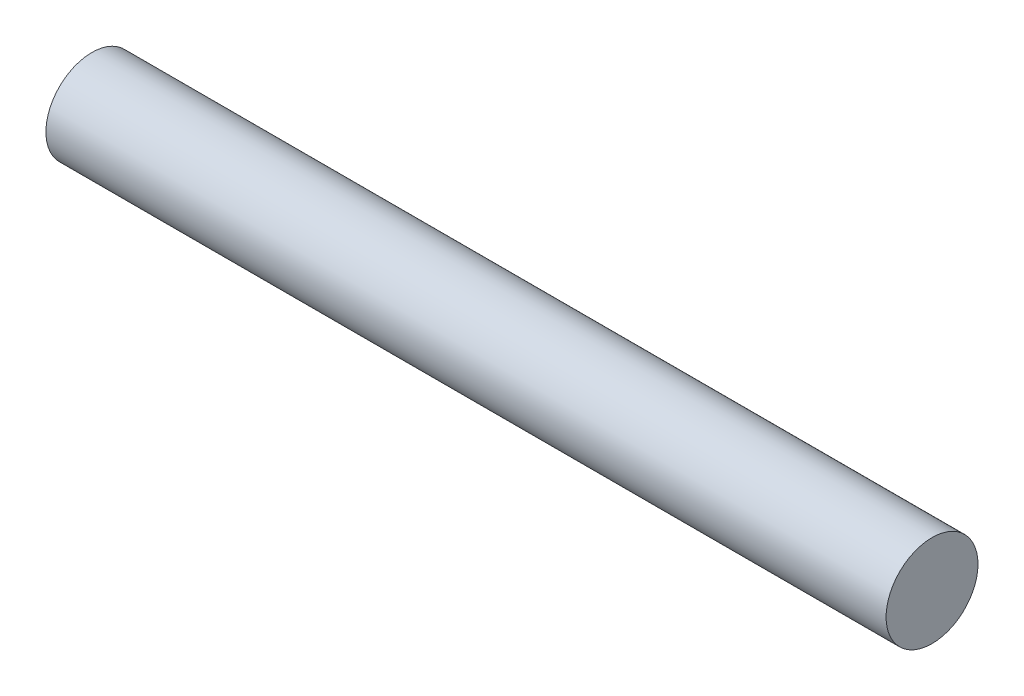
ISO-10303-21;
HEADER;
FILE_DESCRIPTION(('STEP AP214'),'2;1');
FILE_NAME('part.step','',(''),(''),'','','');
FILE_SCHEMA(('AUTOMOTIVE_DESIGN { 1 0 10303 214 1 1 1 1 }'));
ENDSEC;
DATA;
#1=APPLICATION_CONTEXT('core data for automotive mechanical design processes');
#2=APPLICATION_PROTOCOL_DEFINITION('international standard','automotive_design',2000,#1);
#3=PRODUCT_CONTEXT('',#1,'mechanical');
#4=PRODUCT('Part','Part','',(#3));
#5=PRODUCT_RELATED_PRODUCT_CATEGORY('part','',(#4));
#6=PRODUCT_DEFINITION_FORMATION('','',#4);
#7=PRODUCT_DEFINITION_CONTEXT('part definition',#1,'design');
#8=PRODUCT_DEFINITION('design','',#6,#7);
#9=PRODUCT_DEFINITION_SHAPE('','',#8);
#10=(LENGTH_UNIT() NAMED_UNIT(*) SI_UNIT(.MILLI.,.METRE.));
#11=(NAMED_UNIT(*) PLANE_ANGLE_UNIT() SI_UNIT($,.RADIAN.));
#12=(NAMED_UNIT(*) SI_UNIT($,.STERADIAN.) SOLID_ANGLE_UNIT());
#13=UNCERTAINTY_MEASURE_WITH_UNIT(LENGTH_MEASURE(1.E-05),#10,'distance_accuracy_value','');
#14=(GEOMETRIC_REPRESENTATION_CONTEXT(3) GLOBAL_UNCERTAINTY_ASSIGNED_CONTEXT((#13)) GLOBAL_UNIT_ASSIGNED_CONTEXT((#10,
#11,#12)) REPRESENTATION_CONTEXT('',''));
#15=CARTESIAN_POINT('',(0.,0.,0.));
#16=DIRECTION('',(0.,0.,1.));
#17=DIRECTION('',(1.,0.,0.));
#18=AXIS2_PLACEMENT_3D('',#15,#16,#17);
#19=CARTESIAN_POINT('',(0.,0.,0.));
#20=DIRECTION('',(1.,0.,0.));
#21=DIRECTION('',(0.,0.,-1.));
#22=AXIS2_PLACEMENT_3D('',#19,#20,#21);
#23=PLANE('',#22);
#24=CARTESIAN_POINT('',(0.,0.,0.));
#25=DIRECTION('',(1.,0.,0.));
#26=DIRECTION('',(0.,0.,-1.));
#27=AXIS2_PLACEMENT_3D('',#24,#25,#26);
#28=CIRCLE('',#27,11.1125);
#29=CARTESIAN_POINT('',(0.,0.,-11.1125));
#30=VERTEX_POINT('',#29);
#31=EDGE_CURVE('E57',#30,#30,#28,.T.);
#32=ORIENTED_EDGE('',*,*,#31,.F.);
#33=EDGE_LOOP('',(#32));
#34=FACE_BOUND('',#33,.T.);
#35=ADVANCED_FACE('F40',(#34),#23,.F.);
#36=CARTESIAN_POINT('',(203.2,0.,0.));
#37=DIRECTION('',(1.,0.,0.));
#38=DIRECTION('',(0.,0.,-1.));
#39=AXIS2_PLACEMENT_3D('',#36,#37,#38);
#40=PLANE('',#39);
#41=CARTESIAN_POINT('',(203.2,0.,0.));
#42=DIRECTION('',(1.,0.,0.));
#43=DIRECTION('',(0.,0.,-1.));
#44=AXIS2_PLACEMENT_3D('',#41,#42,#43);
#45=CIRCLE('',#44,11.1125);
#46=CARTESIAN_POINT('',(203.2,0.,-11.1125));
#47=VERTEX_POINT('',#46);
#48=EDGE_CURVE('E52',#47,#47,#45,.T.);
#49=ORIENTED_EDGE('',*,*,#48,.T.);
#50=EDGE_LOOP('',(#49));
#51=FACE_BOUND('',#50,.T.);
#52=ADVANCED_FACE('F61',(#51),#40,.T.);
#53=CARTESIAN_POINT('',(0.,0.,0.));
#54=DIRECTION('',(1.,0.,0.));
#55=DIRECTION('',(0.,0.,-1.));
#56=AXIS2_PLACEMENT_3D('',#53,#54,#55);
#57=CYLINDRICAL_SURFACE('',#56,11.1125);
#58=CARTESIAN_POINT('',(47.625,0.,-11.1125));
#59=CARTESIAN_POINT('',(47.6249969209454,-0.174553407523886,-11.1124979250477));
#60=CARTESIAN_POINT('',(47.6105572600004,-0.349138474747723,-11.1083473762574));
#61=CARTESIAN_POINT('',(47.5533017212126,-0.693248536025219,-11.0921943818785));
#62=CARTESIAN_POINT('',(47.5104751051074,-0.862771589842013,-11.0801889649601));
#63=CARTESIAN_POINT('',(47.3979747390138,-1.19174307742137,-11.0496459751665));
#64=CARTESIAN_POINT('',(47.3283384201088,-1.35120519834656,-11.0311175126882));
#65=CARTESIAN_POINT('',(47.1643424385281,-1.65618915829272,-10.9894684057751));
#66=CARTESIAN_POINT('',(47.0699801891466,-1.80170953662033,-10.9663472809399));
#67=CARTESIAN_POINT('',(46.8565944205567,-2.07850493438857,-10.9173126621811));
#68=CARTESIAN_POINT('',(46.7370402032548,-2.20936140927974,-10.8913460408799));
#69=CARTESIAN_POINT('',(46.4777967077689,-2.4494670307049,-10.8398744167858));
#70=CARTESIAN_POINT('',(46.3381044158838,-2.55871293736104,-10.8143694837296));
#71=CARTESIAN_POINT('',(46.0390976873194,-2.75462666635208,-10.7661553611468));
#72=CARTESIAN_POINT('',(45.8794453487095,-2.84079666001565,-10.743512652283));
#73=CARTESIAN_POINT('',(45.5471656813457,-2.98489958254444,-10.7043750834706));
#74=CARTESIAN_POINT('',(45.3745411530875,-3.04283858594704,-10.6878789011373));
#75=CARTESIAN_POINT('',(45.0258898134747,-3.12735012409526,-10.6634535301118));
#76=CARTESIAN_POINT('',(44.850063711606,-3.15468878209524,-10.6553155347989));
#77=CARTESIAN_POINT('',(44.4961468018418,-3.1796143511533,-10.6479055552067));
#78=CARTESIAN_POINT('',(44.3180564944403,-3.17720772687773,-10.6486316444583));
#79=CARTESIAN_POINT('',(43.9707835793133,-3.14331563936109,-10.6586819212577));
#80=CARTESIAN_POINT('',(43.8014993425005,-3.11277517093821,-10.6677266753297));
#81=CARTESIAN_POINT('',(43.4705645388412,-3.0250032541119,-10.6929451555771));
#82=CARTESIAN_POINT('',(43.3089146635562,-2.96776939276483,-10.7091195262254));
#83=CARTESIAN_POINT('',(42.9954590869645,-2.82750706306276,-10.7470077083178));
#84=CARTESIAN_POINT('',(42.8438038975623,-2.74416124986949,-10.7687890479397));
#85=CARTESIAN_POINT('',(42.5563084590737,-2.55426176929016,-10.8154028180027));
#86=CARTESIAN_POINT('',(42.4204717410958,-2.44770293531434,-10.8402359271479));
#87=CARTESIAN_POINT('',(42.1630913537249,-2.2096475948092,-10.8913017291696));
#88=CARTESIAN_POINT('',(42.042279269402,-2.07736261381695,-10.9175518975863));
#89=CARTESIAN_POINT('',(41.824392469221,-1.79408499828813,-10.9676604245912));
#90=CARTESIAN_POINT('',(41.7273189835338,-1.6430913948525,-10.991518659188));
#91=CARTESIAN_POINT('',(41.5592756335462,-1.32544037853267,-11.0343398830398));
#92=CARTESIAN_POINT('',(41.4884547946984,-1.15870008577338,-11.0532747485185));
#93=CARTESIAN_POINT('',(41.3760699473758,-0.815011752573357,-11.0839131173654));
#94=CARTESIAN_POINT('',(41.3344985645731,-0.638066297223607,-11.0956184433431));
#95=CARTESIAN_POINT('',(41.2829799089362,-0.285220391972907,-11.1101961329204));
#96=CARTESIAN_POINT('',(41.2720397960953,-0.109476138141058,-11.1133457065033));
#97=CARTESIAN_POINT('',(41.2793295352529,0.241342111303862,-11.1112630947251));
#98=CARTESIAN_POINT('',(41.2975558871429,0.416416184814409,-11.1060319150925));
#99=CARTESIAN_POINT('',(41.361852830352,0.757267080570624,-11.0879560861276));
#100=CARTESIAN_POINT('',(41.4073549253509,0.923160161129061,-11.0752669816556));
#101=CARTESIAN_POINT('',(41.5242382969007,1.24493128935145,-11.0437294800274));
#102=CARTESIAN_POINT('',(41.5956225662868,1.40080817635734,-11.0248803705959));
#103=CARTESIAN_POINT('',(41.7639870469241,1.70186617512805,-10.98248313356));
#104=CARTESIAN_POINT('',(41.8614879031352,1.84674269738239,-10.9588421154555));
#105=CARTESIAN_POINT('',(42.0786758531974,2.11842116329442,-10.9095849101884));
#106=CARTESIAN_POINT('',(42.1983679939775,2.24521898371334,-10.8839682744896));
#107=CARTESIAN_POINT('',(42.4611948305035,2.48143145498985,-10.832601836615));
#108=CARTESIAN_POINT('',(42.6049682499502,2.59014186600877,-10.8068750851165));
#109=CARTESIAN_POINT('',(42.9092718594415,2.78192756425731,-10.7591049539238));
#110=CARTESIAN_POINT('',(43.0698014662237,2.86500374338532,-10.7370614460898));
#111=CARTESIAN_POINT('',(43.4023947974238,3.00255708412747,-10.6994110884463));
#112=CARTESIAN_POINT('',(43.5743917745548,3.05718580267878,-10.6837702253418));
#113=CARTESIAN_POINT('',(43.9256645227227,3.13657376982815,-10.6607364997541));
#114=CARTESIAN_POINT('',(44.1049380711751,3.16134206919038,-10.6533411380909));
#115=CARTESIAN_POINT('',(44.4584074523086,3.17973113491685,-10.6478657867006));
#116=CARTESIAN_POINT('',(44.6325394885406,3.17449243884464,-10.6494446761783));
#117=CARTESIAN_POINT('',(44.9773273849755,3.13570478644017,-10.6609292290021));
#118=CARTESIAN_POINT('',(45.1479833609788,3.10215677478004,-10.6708346144959));
#119=CARTESIAN_POINT('',(45.4793006642104,3.00840725496853,-10.6976382628572));
#120=CARTESIAN_POINT('',(45.6400461768749,2.94848108210957,-10.7144641732688));
#121=CARTESIAN_POINT('',(45.9493282410116,2.80388932016158,-10.7532059325021));
#122=CARTESIAN_POINT('',(46.0978626257727,2.71921935268476,-10.7751226820013));
#123=CARTESIAN_POINT('',(46.3838663408645,2.52422892624069,-10.8224902446129));
#124=CARTESIAN_POINT('',(46.520800708755,2.41314649009845,-10.8480346154764));
#125=CARTESIAN_POINT('',(46.7744554345985,2.16988999660213,-10.8992962908304));
#126=CARTESIAN_POINT('',(46.8911706940885,2.03771063553156,-10.9250136372452));
#127=CARTESIAN_POINT('',(47.1040415301184,1.75192423437383,-10.9745138582137));
#128=CARTESIAN_POINT('',(47.1995928422905,1.59785447249616,-10.9982301789696));
#129=CARTESIAN_POINT('',(47.3632939337225,1.27516021581407,-11.0402909079746));
#130=CARTESIAN_POINT('',(47.4314586864437,1.10654373578215,-11.0586382501906));
#131=CARTESIAN_POINT('',(47.5310954878403,0.782504650594368,-11.0859465975144));
#132=CARTESIAN_POINT('',(47.5662204894867,0.628273774603719,-11.095826239248));
#133=CARTESIAN_POINT('',(47.6131725808719,0.316036910448357,-11.1091034461528));
#134=CARTESIAN_POINT('',(47.6250027876133,0.158031430215545,-11.1125018785522));
#135=CARTESIAN_POINT('',(47.625,0.,-11.1125));
#136=B_SPLINE_CURVE_WITH_KNOTS('',3,(#58,#59,#60,#61,#62,#63,#64,#65,#66,#67,#68,#69,#70,#71,
#72,#73,#74,#75,#76,#77,#78,#79,#80,#81,#82,#83,#84,#85,#86,#87,#88,#89,#90,#91,#92,#93,#94,#95,
#96,#97,#98,#99,#100,#101,#102,#103,#104,#105,#106,#107,#108,#109,#110,#111,#112,#113,#114,#115,
#116,#117,#118,#119,#120,#121,#122,#123,#124,#125,#126,#127,#128,#129,#130,#131,#132,#133,#134,
#135),.UNSPECIFIED.,.T.,.F.,(4,2,2,2,2,2,2,2,2,2,2,2,2,2,2,2,2,2,2,2,2,2,2,2,2,2,2,2,2,2,2,2,2,
2,2,2,2,2,4),(0.,0.52308015866097,1.04635830192485,1.56890849047136,2.09151336750331,
2.62648400805115,3.16153479124519,3.7073375703884,4.25302285577385,4.78471721907116,
5.31629602904582,5.83064597504067,6.34504242460475,6.86595025224796,7.38697413854032,
7.92763369706471,8.46832126746775,9.01203273003311,9.55560706373196,10.0813466409589,
10.607023131775,11.1221066051124,11.6372496581365,12.1635444648432,12.6899591131061,
13.2335921650388,13.7772063000741,14.3178938521874,14.8584174793803,15.3785360707008,
15.8986373065294,16.4134339037008,16.9283216487885,17.4603990532115,17.992610431924,
18.5384754162283,19.0840415441681,19.5576740551794,20.031243186617),.UNSPECIFIED.);
#137=CARTESIAN_POINT('',(47.625,0.,-11.1125));
#138=VERTEX_POINT('',#137);
#139=EDGE_CURVE('E12',#138,#138,#136,.T.);
#140=ORIENTED_EDGE('',*,*,#139,.F.);
#141=EDGE_LOOP('',(#140));
#142=FACE_BOUND('',#141,.T.);
#143=ORIENTED_EDGE('',*,*,#48,.F.);
#144=EDGE_LOOP('',(#143));
#145=FACE_BOUND('',#144,.T.);
#146=ORIENTED_EDGE('',*,*,#31,.T.);
#147=EDGE_LOOP('',(#146));
#148=FACE_BOUND('',#147,.T.);
#149=ADVANCED_FACE('F77',(#142,#145,#148),#57,.T.);
#150=CARTESIAN_POINT('',(44.45,0.,-11.1125));
#151=DIRECTION('',(0.,0.,1.));
#152=DIRECTION('',(1.,0.,0.));
#153=AXIS2_PLACEMENT_3D('',#150,#151,#152);
#154=CYLINDRICAL_SURFACE('',#153,3.175);
#155=ORIENTED_EDGE('',*,*,#139,.T.);
#156=EDGE_LOOP('',(#155));
#157=FACE_BOUND('',#156,.T.);
#158=CARTESIAN_POINT('',(44.45,0.,0.));
#159=DIRECTION('',(0.,0.,1.));
#160=DIRECTION('',(1.,0.,0.));
#161=AXIS2_PLACEMENT_3D('',#158,#159,#160);
#162=CIRCLE('',#161,3.175);
#163=CARTESIAN_POINT('',(47.625,0.,0.));
#164=VERTEX_POINT('',#163);
#165=EDGE_CURVE('E63',#164,#164,#162,.T.);
#166=ORIENTED_EDGE('',*,*,#165,.T.);
#167=EDGE_LOOP('',(#166));
#168=FACE_BOUND('',#167,.T.);
#169=ADVANCED_FACE('F69',(#157,#168),#154,.F.);
#170=CARTESIAN_POINT('',(44.45,0.,0.));
#171=DIRECTION('',(0.,0.,1.));
#172=DIRECTION('',(1.,0.,0.));
#173=AXIS2_PLACEMENT_3D('',#170,#171,#172);
#174=PLANE('',#173);
#175=ORIENTED_EDGE('',*,*,#165,.F.);
#176=EDGE_LOOP('',(#175));
#177=FACE_BOUND('',#176,.T.);
#178=ADVANCED_FACE('F71',(#177),#174,.F.);
#179=CLOSED_SHELL('',(#35,#52,#149,#169,#178));
#180=MANIFOLD_SOLID_BREP('B2',#179);
#181=ADVANCED_BREP_SHAPE_REPRESENTATION('',(#18,#180),#14);
#182=SHAPE_DEFINITION_REPRESENTATION(#9,#181);
ENDSEC;
END-ISO-10303-21;
